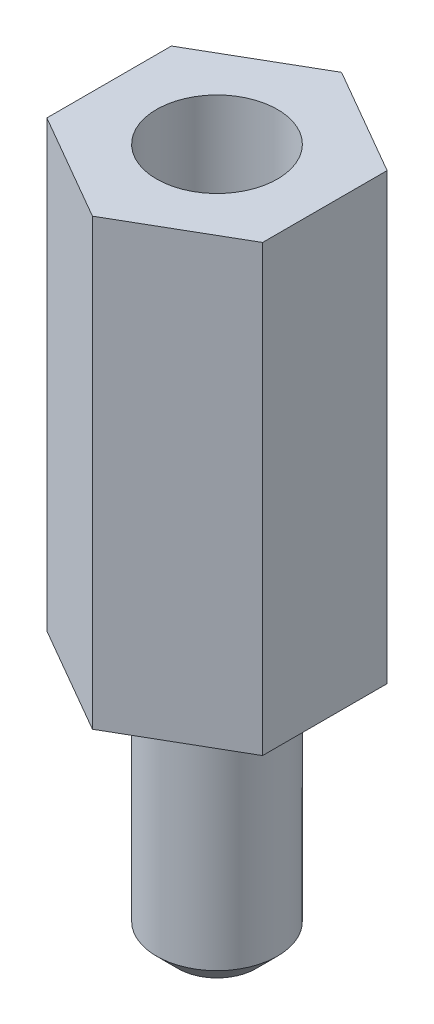
ISO-10303-21;
HEADER;
FILE_DESCRIPTION(('STEP AP214'),'2;1');
FILE_NAME('part.step','',(''),(''),'','','');
FILE_SCHEMA(('AUTOMOTIVE_DESIGN { 1 0 10303 214 1 1 1 1 }'));
ENDSEC;
DATA;
#1=APPLICATION_CONTEXT('core data for automotive mechanical design processes');
#2=APPLICATION_PROTOCOL_DEFINITION('international standard','automotive_design',2000,#1);
#3=PRODUCT_CONTEXT('',#1,'mechanical');
#4=PRODUCT('Part','Part','',(#3));
#5=PRODUCT_RELATED_PRODUCT_CATEGORY('part','',(#4));
#6=PRODUCT_DEFINITION_FORMATION('','',#4);
#7=PRODUCT_DEFINITION_CONTEXT('part definition',#1,'design');
#8=PRODUCT_DEFINITION('design','',#6,#7);
#9=PRODUCT_DEFINITION_SHAPE('','',#8);
#10=(LENGTH_UNIT() NAMED_UNIT(*) SI_UNIT(.MILLI.,.METRE.));
#11=(NAMED_UNIT(*) PLANE_ANGLE_UNIT() SI_UNIT($,.RADIAN.));
#12=(NAMED_UNIT(*) SI_UNIT($,.STERADIAN.) SOLID_ANGLE_UNIT());
#13=UNCERTAINTY_MEASURE_WITH_UNIT(LENGTH_MEASURE(1.E-05),#10,'distance_accuracy_value','');
#14=(GEOMETRIC_REPRESENTATION_CONTEXT(3) GLOBAL_UNCERTAINTY_ASSIGNED_CONTEXT((#13)) GLOBAL_UNIT_ASSIGNED_CONTEXT((#10,
#11,#12)) REPRESENTATION_CONTEXT('',''));
#15=CARTESIAN_POINT('',(0.,0.,0.));
#16=DIRECTION('',(0.,0.,1.));
#17=DIRECTION('',(1.,0.,0.));
#18=AXIS2_PLACEMENT_3D('',#15,#16,#17);
#19=CARTESIAN_POINT('',(2.49999999999999,10.3,-1.44337567297409));
#20=DIRECTION('',(-0.499999999999995,0.,0.866025403784441));
#21=DIRECTION('',(0.866025403784442,0.,0.499999999999995));
#22=AXIS2_PLACEMENT_3D('',#19,#20,#21);
#23=PLANE('',#22);
#24=DIRECTION('',(-0.866025403784442,0.,-0.499999999999995));
#25=VECTOR('',#24,1.);
#26=CARTESIAN_POINT('',(2.49999999999999,0.,-1.44337567297409));
#27=LINE('',#26,#25);
#28=CARTESIAN_POINT('',(2.49999999999999,0.,-1.44337567297409));
#29=VERTEX_POINT('',#28);
#30=CARTESIAN_POINT('',(0.,0.,-2.88675134594813));
#31=VERTEX_POINT('',#30);
#32=EDGE_CURVE('E130',#29,#31,#27,.T.);
#33=ORIENTED_EDGE('',*,*,#32,.T.);
#34=DIRECTION('',(0.,-1.,0.));
#35=VECTOR('',#34,1.);
#36=CARTESIAN_POINT('',(0.,10.3,-2.88675134594813));
#37=LINE('',#36,#35);
#38=CARTESIAN_POINT('',(0.,10.3,-2.88675134594813));
#39=VERTEX_POINT('',#38);
#40=EDGE_CURVE('E158',#39,#31,#37,.T.);
#41=ORIENTED_EDGE('',*,*,#40,.F.);
#42=DIRECTION('',(-0.866025403784442,0.,-0.499999999999995));
#43=VECTOR('',#42,1.);
#44=CARTESIAN_POINT('',(2.49999999999999,10.3,-1.44337567297409));
#45=LINE('',#44,#43);
#46=CARTESIAN_POINT('',(2.49999999999999,10.3,-1.44337567297409));
#47=VERTEX_POINT('',#46);
#48=EDGE_CURVE('E147',#47,#39,#45,.T.);
#49=ORIENTED_EDGE('',*,*,#48,.F.);
#50=DIRECTION('',(0.,-1.,0.));
#51=VECTOR('',#50,1.);
#52=CARTESIAN_POINT('',(2.49999999999999,10.3,-1.44337567297409));
#53=LINE('',#52,#51);
#54=EDGE_CURVE('E126',#47,#29,#53,.T.);
#55=ORIENTED_EDGE('',*,*,#54,.T.);
#56=EDGE_LOOP('',(#33,#41,#49,#55));
#57=FACE_BOUND('',#56,.T.);
#58=ADVANCED_FACE('F39',(#57),#23,.F.);
#59=CARTESIAN_POINT('',(0.,10.3,-2.88675134594813));
#60=DIRECTION('',(0.500000000000001,0.,0.866025403784438));
#61=DIRECTION('',(0.866025403784438,0.,-0.500000000000001));
#62=AXIS2_PLACEMENT_3D('',#59,#60,#61);
#63=PLANE('',#62);
#64=DIRECTION('',(-0.866025403784438,0.,0.500000000000001));
#65=VECTOR('',#64,1.);
#66=CARTESIAN_POINT('',(0.,0.,-2.88675134594813));
#67=LINE('',#66,#65);
#68=CARTESIAN_POINT('',(-2.50000000000001,0.,-1.44337567297406));
#69=VERTEX_POINT('',#68);
#70=EDGE_CURVE('E134',#31,#69,#67,.T.);
#71=ORIENTED_EDGE('',*,*,#70,.T.);
#72=DIRECTION('',(0.,-1.,0.));
#73=VECTOR('',#72,1.);
#74=CARTESIAN_POINT('',(-2.50000000000001,10.3,-1.44337567297406));
#75=LINE('',#74,#73);
#76=CARTESIAN_POINT('',(-2.50000000000001,10.3,-1.44337567297406));
#77=VERTEX_POINT('',#76);
#78=EDGE_CURVE('E154',#77,#69,#75,.T.);
#79=ORIENTED_EDGE('',*,*,#78,.F.);
#80=DIRECTION('',(-0.866025403784438,0.,0.500000000000001));
#81=VECTOR('',#80,1.);
#82=CARTESIAN_POINT('',(0.,10.3,-2.88675134594813));
#83=LINE('',#82,#81);
#84=EDGE_CURVE('E95',#39,#77,#83,.T.);
#85=ORIENTED_EDGE('',*,*,#84,.F.);
#86=ORIENTED_EDGE('',*,*,#40,.T.);
#87=EDGE_LOOP('',(#71,#79,#85,#86));
#88=FACE_BOUND('',#87,.T.);
#89=ADVANCED_FACE('F200',(#88),#63,.F.);
#90=CARTESIAN_POINT('',(-2.50000000000001,10.3,-1.44337567297406));
#91=DIRECTION('',(1.,0.,0.));
#92=DIRECTION('',(0.,0.,-1.));
#93=AXIS2_PLACEMENT_3D('',#90,#91,#92);
#94=PLANE('',#93);
#95=DIRECTION('',(0.,0.,1.));
#96=VECTOR('',#95,1.);
#97=CARTESIAN_POINT('',(-2.50000000000001,0.,-1.44337567297406));
#98=LINE('',#97,#96);
#99=CARTESIAN_POINT('',(-2.5,0.,1.44337567297408));
#100=VERTEX_POINT('',#99);
#101=EDGE_CURVE('E138',#69,#100,#98,.T.);
#102=ORIENTED_EDGE('',*,*,#101,.T.);
#103=DIRECTION('',(0.,-1.,0.));
#104=VECTOR('',#103,1.);
#105=CARTESIAN_POINT('',(-2.5,10.3,1.44337567297408));
#106=LINE('',#105,#104);
#107=CARTESIAN_POINT('',(-2.5,10.3,1.44337567297408));
#108=VERTEX_POINT('',#107);
#109=EDGE_CURVE('E119',#108,#100,#106,.T.);
#110=ORIENTED_EDGE('',*,*,#109,.F.);
#111=DIRECTION('',(0.,0.,1.));
#112=VECTOR('',#111,1.);
#113=CARTESIAN_POINT('',(-2.50000000000001,10.3,-1.44337567297406));
#114=LINE('',#113,#112);
#115=EDGE_CURVE('E108',#77,#108,#114,.T.);
#116=ORIENTED_EDGE('',*,*,#115,.F.);
#117=ORIENTED_EDGE('',*,*,#78,.T.);
#118=EDGE_LOOP('',(#102,#110,#116,#117));
#119=FACE_BOUND('',#118,.T.);
#120=ADVANCED_FACE('F205',(#119),#94,.F.);
#121=CARTESIAN_POINT('',(-2.5,10.3,1.44337567297408));
#122=DIRECTION('',(0.499999999999995,0.,-0.866025403784441));
#123=DIRECTION('',(-0.866025403784442,0.,-0.499999999999995));
#124=AXIS2_PLACEMENT_3D('',#121,#122,#123);
#125=PLANE('',#124);
#126=DIRECTION('',(0.866025403784441,0.,0.499999999999995));
#127=VECTOR('',#126,1.);
#128=CARTESIAN_POINT('',(-2.5,0.,1.44337567297408));
#129=LINE('',#128,#127);
#130=CARTESIAN_POINT('',(0.,0.,2.88675134594813));
#131=VERTEX_POINT('',#130);
#132=EDGE_CURVE('E117',#100,#131,#129,.T.);
#133=ORIENTED_EDGE('',*,*,#132,.T.);
#134=DIRECTION('',(0.,-1.,0.));
#135=VECTOR('',#134,1.);
#136=CARTESIAN_POINT('',(0.,10.3,2.88675134594813));
#137=LINE('',#136,#135);
#138=CARTESIAN_POINT('',(0.,10.3,2.88675134594813));
#139=VERTEX_POINT('',#138);
#140=EDGE_CURVE('E114',#139,#131,#137,.T.);
#141=ORIENTED_EDGE('',*,*,#140,.F.);
#142=DIRECTION('',(0.866025403784441,0.,0.499999999999995));
#143=VECTOR('',#142,1.);
#144=CARTESIAN_POINT('',(-2.5,10.3,1.44337567297408));
#145=LINE('',#144,#143);
#146=EDGE_CURVE('E102',#108,#139,#145,.T.);
#147=ORIENTED_EDGE('',*,*,#146,.F.);
#148=ORIENTED_EDGE('',*,*,#109,.T.);
#149=EDGE_LOOP('',(#133,#141,#147,#148));
#150=FACE_BOUND('',#149,.T.);
#151=ADVANCED_FACE('F115',(#150),#125,.F.);
#152=CARTESIAN_POINT('',(0.,10.3,2.88675134594813));
#153=DIRECTION('',(-0.500000000000007,0.,-0.866025403784435));
#154=DIRECTION('',(-0.866025403784435,0.,0.500000000000007));
#155=AXIS2_PLACEMENT_3D('',#152,#153,#154);
#156=PLANE('',#155);
#157=DIRECTION('',(0.866025403784434,0.,-0.500000000000007));
#158=VECTOR('',#157,1.);
#159=CARTESIAN_POINT('',(0.,0.,2.88675134594813));
#160=LINE('',#159,#158);
#161=CARTESIAN_POINT('',(2.50000000000002,0.,1.44337567297404));
#162=VERTEX_POINT('',#161);
#163=EDGE_CURVE('E80',#131,#162,#160,.T.);
#164=ORIENTED_EDGE('',*,*,#163,.T.);
#165=DIRECTION('',(0.,-1.,0.));
#166=VECTOR('',#165,1.);
#167=CARTESIAN_POINT('',(2.50000000000002,10.3,1.44337567297404));
#168=LINE('',#167,#166);
#169=CARTESIAN_POINT('',(2.50000000000002,10.3,1.44337567297404));
#170=VERTEX_POINT('',#169);
#171=EDGE_CURVE('E120',#170,#162,#168,.T.);
#172=ORIENTED_EDGE('',*,*,#171,.F.);
#173=DIRECTION('',(0.866025403784434,0.,-0.500000000000007));
#174=VECTOR('',#173,1.);
#175=CARTESIAN_POINT('',(0.,10.3,2.88675134594813));
#176=LINE('',#175,#174);
#177=EDGE_CURVE('E106',#139,#170,#176,.T.);
#178=ORIENTED_EDGE('',*,*,#177,.F.);
#179=ORIENTED_EDGE('',*,*,#140,.T.);
#180=EDGE_LOOP('',(#164,#172,#178,#179));
#181=FACE_BOUND('',#180,.T.);
#182=ADVANCED_FACE('F122',(#181),#156,.F.);
#183=CARTESIAN_POINT('',(2.50000000000002,10.3,1.44337567297404));
#184=DIRECTION('',(-1.,0.,0.));
#185=DIRECTION('',(0.,0.,1.));
#186=AXIS2_PLACEMENT_3D('',#183,#184,#185);
#187=PLANE('',#186);
#188=DIRECTION('',(0.,0.,-1.));
#189=VECTOR('',#188,1.);
#190=CARTESIAN_POINT('',(2.50000000000002,0.,1.44337567297404));
#191=LINE('',#190,#189);
#192=EDGE_CURVE('E86',#162,#29,#191,.T.);
#193=ORIENTED_EDGE('',*,*,#192,.T.);
#194=ORIENTED_EDGE('',*,*,#54,.F.);
#195=DIRECTION('',(0.,0.,-1.));
#196=VECTOR('',#195,1.);
#197=CARTESIAN_POINT('',(2.50000000000002,10.3,1.44337567297404));
#198=LINE('',#197,#196);
#199=EDGE_CURVE('E57',#170,#47,#198,.T.);
#200=ORIENTED_EDGE('',*,*,#199,.F.);
#201=ORIENTED_EDGE('',*,*,#171,.T.);
#202=EDGE_LOOP('',(#193,#194,#200,#201));
#203=FACE_BOUND('',#202,.T.);
#204=ADVANCED_FACE('F188',(#203),#187,.F.);
#205=CARTESIAN_POINT('',(0.,10.3,0.));
#206=DIRECTION('',(0.,1.,0.));
#207=DIRECTION('',(0.,0.,1.));
#208=AXIS2_PLACEMENT_3D('',#205,#206,#207);
#209=PLANE('',#208);
#210=CARTESIAN_POINT('',(0.,10.3,0.));
#211=DIRECTION('',(0.,1.,0.));
#212=DIRECTION('',(0.,0.,1.));
#213=AXIS2_PLACEMENT_3D('',#210,#211,#212);
#214=CIRCLE('',#213,1.4);
#215=CARTESIAN_POINT('',(0.,10.3,1.4));
#216=VERTEX_POINT('',#215);
#217=EDGE_CURVE('E172',#216,#216,#214,.T.);
#218=ORIENTED_EDGE('',*,*,#217,.F.);
#219=EDGE_LOOP('',(#218));
#220=FACE_BOUND('',#219,.T.);
#221=ORIENTED_EDGE('',*,*,#48,.T.);
#222=ORIENTED_EDGE('',*,*,#84,.T.);
#223=ORIENTED_EDGE('',*,*,#115,.T.);
#224=ORIENTED_EDGE('',*,*,#146,.T.);
#225=ORIENTED_EDGE('',*,*,#177,.T.);
#226=ORIENTED_EDGE('',*,*,#199,.T.);
#227=EDGE_LOOP('',(#221,#222,#223,#224,#225,#226));
#228=FACE_BOUND('',#227,.T.);
#229=ADVANCED_FACE('F104',(#220,#228),#209,.T.);
#230=CARTESIAN_POINT('',(0.,0.,0.));
#231=DIRECTION('',(0.,1.,0.));
#232=DIRECTION('',(0.,0.,1.));
#233=AXIS2_PLACEMENT_3D('',#230,#231,#232);
#234=PLANE('',#233);
#235=CARTESIAN_POINT('',(0.,0.,0.));
#236=DIRECTION('',(0.,-1.,0.));
#237=DIRECTION('',(0.,0.,-1.));
#238=AXIS2_PLACEMENT_3D('',#235,#236,#237);
#239=CIRCLE('',#238,1.4);
#240=CARTESIAN_POINT('',(0.,0.,-1.4));
#241=VERTEX_POINT('',#240);
#242=EDGE_CURVE('E160',#241,#241,#239,.T.);
#243=ORIENTED_EDGE('',*,*,#242,.F.);
#244=EDGE_LOOP('',(#243));
#245=FACE_BOUND('',#244,.T.);
#246=ORIENTED_EDGE('',*,*,#32,.F.);
#247=ORIENTED_EDGE('',*,*,#192,.F.);
#248=ORIENTED_EDGE('',*,*,#163,.F.);
#249=ORIENTED_EDGE('',*,*,#132,.F.);
#250=ORIENTED_EDGE('',*,*,#101,.F.);
#251=ORIENTED_EDGE('',*,*,#70,.F.);
#252=EDGE_LOOP('',(#246,#247,#248,#249,#250,#251));
#253=FACE_BOUND('',#252,.T.);
#254=ADVANCED_FACE('F187',(#245,#253),#234,.F.);
#255=CARTESIAN_POINT('',(0.,-5.8,0.));
#256=DIRECTION('',(0.,1.,0.));
#257=DIRECTION('',(0.,0.,1.));
#258=AXIS2_PLACEMENT_3D('',#255,#256,#257);
#259=CYLINDRICAL_SURFACE('',#258,1.4);
#260=CARTESIAN_POINT('',(0.,-5.3,0.));
#261=DIRECTION('',(0.,-1.,0.));
#262=DIRECTION('',(0.,0.,-1.));
#263=AXIS2_PLACEMENT_3D('',#260,#261,#262);
#264=CIRCLE('',#263,1.4);
#265=CARTESIAN_POINT('',(0.,-5.3,-1.4));
#266=VERTEX_POINT('',#265);
#267=EDGE_CURVE('E11',#266,#266,#264,.F.);
#268=ORIENTED_EDGE('',*,*,#267,.T.);
#269=EDGE_LOOP('',(#268));
#270=FACE_BOUND('',#269,.T.);
#271=ORIENTED_EDGE('',*,*,#242,.T.);
#272=EDGE_LOOP('',(#271));
#273=FACE_BOUND('',#272,.T.);
#274=ADVANCED_FACE('F194',(#270,#273),#259,.T.);
#275=CARTESIAN_POINT('',(0.,-5.8,0.));
#276=DIRECTION('',(0.,-1.,0.));
#277=DIRECTION('',(0.,0.,-1.));
#278=AXIS2_PLACEMENT_3D('',#275,#276,#277);
#279=PLANE('',#278);
#280=CARTESIAN_POINT('',(0.,-5.8,0.));
#281=DIRECTION('',(0.,-1.,0.));
#282=DIRECTION('',(0.,0.,-1.));
#283=AXIS2_PLACEMENT_3D('',#280,#281,#282);
#284=CIRCLE('',#283,0.900000000000001);
#285=CARTESIAN_POINT('',(0.,-5.8,-0.900000000000001));
#286=VERTEX_POINT('',#285);
#287=EDGE_CURVE('E49',#286,#286,#284,.T.);
#288=ORIENTED_EDGE('',*,*,#287,.T.);
#289=EDGE_LOOP('',(#288));
#290=FACE_BOUND('',#289,.T.);
#291=ADVANCED_FACE('F238',(#290),#279,.T.);
#292=CARTESIAN_POINT('',(0.,-5.8,0.));
#293=DIRECTION('',(0.,1.,0.));
#294=DIRECTION('',(0.,0.,1.));
#295=AXIS2_PLACEMENT_3D('',#292,#293,#294);
#296=CONICAL_SURFACE('',#295,0.900000000000001,0.785398163397447);
#297=ORIENTED_EDGE('',*,*,#267,.F.);
#298=EDGE_LOOP('',(#297));
#299=FACE_BOUND('',#298,.T.);
#300=ORIENTED_EDGE('',*,*,#287,.F.);
#301=EDGE_LOOP('',(#300));
#302=FACE_BOUND('',#301,.T.);
#303=ADVANCED_FACE('F41',(#299,#302),#296,.T.);
#304=CARTESIAN_POINT('',(0.,3.3,0.));
#305=DIRECTION('',(0.,1.,0.));
#306=DIRECTION('',(0.,0.,1.));
#307=AXIS2_PLACEMENT_3D('',#304,#305,#306);
#308=CYLINDRICAL_SURFACE('',#307,1.4);
#309=CARTESIAN_POINT('',(0.,3.3,0.));
#310=DIRECTION('',(0.,1.,0.));
#311=DIRECTION('',(0.,0.,1.));
#312=AXIS2_PLACEMENT_3D('',#309,#310,#311);
#313=CIRCLE('',#312,1.4);
#314=CARTESIAN_POINT('',(0.,3.3,1.4));
#315=VERTEX_POINT('',#314);
#316=EDGE_CURVE('E135',#315,#315,#313,.T.);
#317=ORIENTED_EDGE('',*,*,#316,.F.);
#318=EDGE_LOOP('',(#317));
#319=FACE_BOUND('',#318,.T.);
#320=ORIENTED_EDGE('',*,*,#217,.T.);
#321=EDGE_LOOP('',(#320));
#322=FACE_BOUND('',#321,.T.);
#323=ADVANCED_FACE('F184',(#319,#322),#308,.F.);
#324=CARTESIAN_POINT('',(0.,3.3,0.));
#325=DIRECTION('',(0.,1.,0.));
#326=DIRECTION('',(0.,0.,1.));
#327=AXIS2_PLACEMENT_3D('',#324,#325,#326);
#328=PLANE('',#327);
#329=ORIENTED_EDGE('',*,*,#316,.T.);
#330=EDGE_LOOP('',(#329));
#331=FACE_BOUND('',#330,.T.);
#332=ADVANCED_FACE('F266',(#331),#328,.T.);
#333=CLOSED_SHELL('',(#58,#89,#120,#151,#182,#204,#229,#254,#274,#291,#303,#323,#332));
#334=MANIFOLD_SOLID_BREP('B2',#333);
#335=ADVANCED_BREP_SHAPE_REPRESENTATION('',(#18,#334),#14);
#336=SHAPE_DEFINITION_REPRESENTATION(#9,#335);
ENDSEC;
END-ISO-10303-21;
